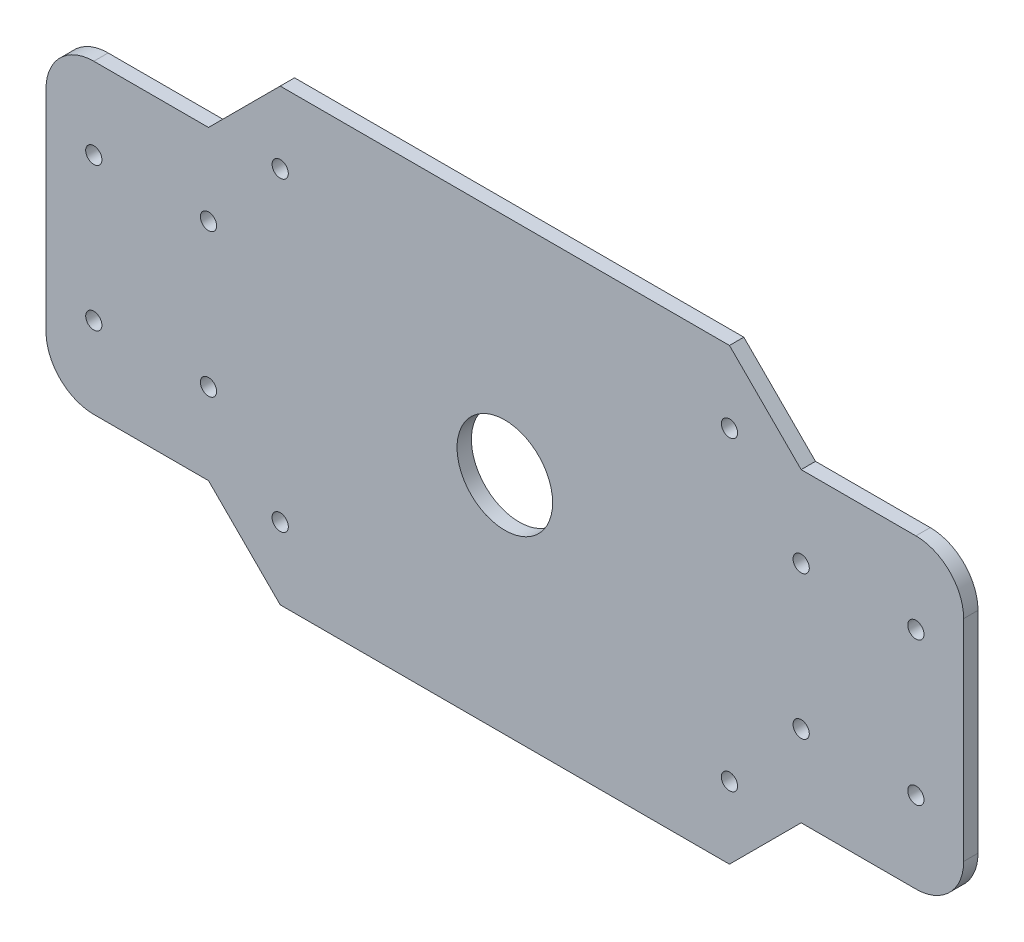
ISO-10303-21;
HEADER;
FILE_DESCRIPTION(('STEP AP214'),'2;1');
FILE_NAME('part.step','',(''),(''),'','','');
FILE_SCHEMA(('AUTOMOTIVE_DESIGN { 1 0 10303 214 1 1 1 1 }'));
ENDSEC;
DATA;
#1=APPLICATION_CONTEXT('core data for automotive mechanical design processes');
#2=APPLICATION_PROTOCOL_DEFINITION('international standard','automotive_design',2000,#1);
#3=PRODUCT_CONTEXT('',#1,'mechanical');
#4=PRODUCT('Part','Part','',(#3));
#5=PRODUCT_RELATED_PRODUCT_CATEGORY('part','',(#4));
#6=PRODUCT_DEFINITION_FORMATION('','',#4);
#7=PRODUCT_DEFINITION_CONTEXT('part definition',#1,'design');
#8=PRODUCT_DEFINITION('design','',#6,#7);
#9=PRODUCT_DEFINITION_SHAPE('','',#8);
#10=(LENGTH_UNIT() NAMED_UNIT(*) SI_UNIT(.MILLI.,.METRE.));
#11=(NAMED_UNIT(*) PLANE_ANGLE_UNIT() SI_UNIT($,.RADIAN.));
#12=(NAMED_UNIT(*) SI_UNIT($,.STERADIAN.) SOLID_ANGLE_UNIT());
#13=UNCERTAINTY_MEASURE_WITH_UNIT(LENGTH_MEASURE(1.E-05),#10,'distance_accuracy_value','');
#14=(GEOMETRIC_REPRESENTATION_CONTEXT(3) GLOBAL_UNCERTAINTY_ASSIGNED_CONTEXT((#13)) GLOBAL_UNIT_ASSIGNED_CONTEXT((#10,
#11,#12)) REPRESENTATION_CONTEXT('',''));
#15=CARTESIAN_POINT('',(0.,0.,0.));
#16=DIRECTION('',(0.,0.,1.));
#17=DIRECTION('',(1.,0.,0.));
#18=AXIS2_PLACEMENT_3D('',#15,#16,#17);
#19=CARTESIAN_POINT('',(-86.0000000000001,-24.5497889815793,3.));
#20=DIRECTION('',(0.,0.,1.));
#21=DIRECTION('',(1.,0.,0.));
#22=AXIS2_PLACEMENT_3D('',#19,#20,#21);
#23=PLANE('',#22);
#24=CARTESIAN_POINT('',(47.,-78.5497889815793,3.));
#25=DIRECTION('',(0.,0.,1.));
#26=DIRECTION('',(1.,0.,0.));
#27=AXIS2_PLACEMENT_3D('',#24,#25,#26);
#28=CIRCLE('',#27,1.70000000003747);
#29=CARTESIAN_POINT('',(48.7000000000375,-78.5497889815793,3.));
#30=VERTEX_POINT('',#29);
#31=EDGE_CURVE('E385',#30,#30,#28,.T.);
#32=ORIENTED_EDGE('',*,*,#31,.F.);
#33=EDGE_LOOP('',(#32));
#34=FACE_BOUND('',#33,.T.);
#35=CARTESIAN_POINT('',(-47.,-14.5497889815793,3.));
#36=DIRECTION('',(0.,0.,1.));
#37=DIRECTION('',(1.,0.,0.));
#38=AXIS2_PLACEMENT_3D('',#35,#36,#37);
#39=CIRCLE('',#38,1.70000000004367);
#40=CARTESIAN_POINT('',(-45.2999999999563,-14.5497889815793,3.));
#41=VERTEX_POINT('',#40);
#42=EDGE_CURVE('E397',#41,#41,#39,.T.);
#43=ORIENTED_EDGE('',*,*,#42,.F.);
#44=EDGE_LOOP('',(#43));
#45=FACE_BOUND('',#44,.T.);
#46=CARTESIAN_POINT('',(62.0000000000001,-31.5497889815793,3.));
#47=DIRECTION('',(0.,0.,1.));
#48=DIRECTION('',(1.,0.,0.));
#49=AXIS2_PLACEMENT_3D('',#46,#47,#48);
#50=CIRCLE('',#49,1.69999999931605);
#51=CARTESIAN_POINT('',(63.6999999993161,-31.5497889815793,3.));
#52=VERTEX_POINT('',#51);
#53=EDGE_CURVE('E409',#52,#52,#50,.T.);
#54=ORIENTED_EDGE('',*,*,#53,.F.);
#55=EDGE_LOOP('',(#54));
#56=FACE_BOUND('',#55,.T.);
#57=CARTESIAN_POINT('',(62.0000000000001,-61.5497889815793,3.));
#58=DIRECTION('',(0.,0.,1.));
#59=DIRECTION('',(1.,0.,0.));
#60=AXIS2_PLACEMENT_3D('',#57,#58,#59);
#61=CIRCLE('',#60,1.69999999931605);
#62=CARTESIAN_POINT('',(63.6999999993161,-61.5497889815793,3.));
#63=VERTEX_POINT('',#62);
#64=EDGE_CURVE('E421',#63,#63,#61,.T.);
#65=ORIENTED_EDGE('',*,*,#64,.F.);
#66=EDGE_LOOP('',(#65));
#67=FACE_BOUND('',#66,.T.);
#68=CARTESIAN_POINT('',(-62.0000000000001,-61.5497889815793,3.));
#69=DIRECTION('',(0.,0.,1.));
#70=DIRECTION('',(1.,0.,0.));
#71=AXIS2_PLACEMENT_3D('',#68,#69,#70);
#72=CIRCLE('',#71,1.69999999767219);
#73=CARTESIAN_POINT('',(-60.3000000023279,-61.5497889815793,3.));
#74=VERTEX_POINT('',#73);
#75=EDGE_CURVE('E433',#74,#74,#72,.T.);
#76=ORIENTED_EDGE('',*,*,#75,.F.);
#77=EDGE_LOOP('',(#76));
#78=FACE_BOUND('',#77,.T.);
#79=CARTESIAN_POINT('',(-86.0000000000001,-31.5497889815793,3.));
#80=DIRECTION('',(0.,0.,1.));
#81=DIRECTION('',(1.,0.,0.));
#82=AXIS2_PLACEMENT_3D('',#79,#80,#81);
#83=CIRCLE('',#82,1.69999999767218);
#84=CARTESIAN_POINT('',(-84.3000000023279,-31.5497889815793,3.));
#85=VERTEX_POINT('',#84);
#86=EDGE_CURVE('E445',#85,#85,#83,.T.);
#87=ORIENTED_EDGE('',*,*,#86,.F.);
#88=EDGE_LOOP('',(#87));
#89=FACE_BOUND('',#88,.T.);
#90=CARTESIAN_POINT('',(-86.0000000000001,-24.5497889815793,3.));
#91=DIRECTION('',(0.,0.,1.));
#92=DIRECTION('',(1.,0.,0.));
#93=AXIS2_PLACEMENT_3D('',#90,#91,#92);
#94=CIRCLE('',#93,9.99999999999998);
#95=CARTESIAN_POINT('',(-86.0000000000001,-14.5497889815793,3.));
#96=VERTEX_POINT('',#95);
#97=CARTESIAN_POINT('',(-96.0000000000001,-24.5497889815793,3.));
#98=VERTEX_POINT('',#97);
#99=EDGE_CURVE('E215',#96,#98,#94,.T.);
#100=ORIENTED_EDGE('',*,*,#99,.T.);
#101=DIRECTION('',(0.,-1.,0.));
#102=VECTOR('',#101,1.);
#103=CARTESIAN_POINT('',(-96.0000000000001,-24.5497889815793,3.));
#104=LINE('',#103,#102);
#105=CARTESIAN_POINT('',(-96.0000000000001,-68.5497889815793,3.));
#106=VERTEX_POINT('',#105);
#107=EDGE_CURVE('E123',#98,#106,#104,.T.);
#108=ORIENTED_EDGE('',*,*,#107,.T.);
#109=CARTESIAN_POINT('',(-86.0000000000001,-68.5497889815793,3.));
#110=DIRECTION('',(0.,0.,1.));
#111=DIRECTION('',(1.,0.,0.));
#112=AXIS2_PLACEMENT_3D('',#109,#110,#111);
#113=CIRCLE('',#112,9.99999999999998);
#114=CARTESIAN_POINT('',(-86.0000000000001,-78.5497889815793,3.));
#115=VERTEX_POINT('',#114);
#116=EDGE_CURVE('E254',#106,#115,#113,.T.);
#117=ORIENTED_EDGE('',*,*,#116,.T.);
#118=DIRECTION('',(1.,0.,0.));
#119=VECTOR('',#118,1.);
#120=CARTESIAN_POINT('',(-86.0000000000001,-78.5497889815793,3.));
#121=LINE('',#120,#119);
#122=CARTESIAN_POINT('',(-62.,-78.5497889815793,3.));
#123=VERTEX_POINT('',#122);
#124=EDGE_CURVE('E273',#115,#123,#121,.T.);
#125=ORIENTED_EDGE('',*,*,#124,.T.);
#126=DIRECTION('',(0.707106781186547,-0.707106781186548,0.));
#127=VECTOR('',#126,1.);
#128=CARTESIAN_POINT('',(-62.,-78.5497889815793,3.));
#129=LINE('',#128,#127);
#130=CARTESIAN_POINT('',(-47.,-93.5497889815793,3.));
#131=VERTEX_POINT('',#130);
#132=EDGE_CURVE('E270',#123,#131,#129,.T.);
#133=ORIENTED_EDGE('',*,*,#132,.T.);
#134=DIRECTION('',(1.,0.,0.));
#135=VECTOR('',#134,1.);
#136=CARTESIAN_POINT('',(-47.,-93.5497889815793,3.));
#137=LINE('',#136,#135);
#138=CARTESIAN_POINT('',(47.,-93.5497889815793,3.));
#139=VERTEX_POINT('',#138);
#140=EDGE_CURVE('E272',#131,#139,#137,.T.);
#141=ORIENTED_EDGE('',*,*,#140,.T.);
#142=DIRECTION('',(0.707106781186546,0.707106781186549,0.));
#143=VECTOR('',#142,1.);
#144=CARTESIAN_POINT('',(47.,-93.5497889815793,3.));
#145=LINE('',#144,#143);
#146=CARTESIAN_POINT('',(62.,-78.5497889815793,3.));
#147=VERTEX_POINT('',#146);
#148=EDGE_CURVE('E275',#139,#147,#145,.T.);
#149=ORIENTED_EDGE('',*,*,#148,.T.);
#150=DIRECTION('',(1.,0.,0.));
#151=VECTOR('',#150,1.);
#152=CARTESIAN_POINT('',(62.,-78.5497889815793,3.));
#153=LINE('',#152,#151);
#154=CARTESIAN_POINT('',(86.,-78.5497889815793,3.));
#155=VERTEX_POINT('',#154);
#156=EDGE_CURVE('E281',#147,#155,#153,.T.);
#157=ORIENTED_EDGE('',*,*,#156,.T.);
#158=CARTESIAN_POINT('',(86.,-68.5497889815793,3.));
#159=DIRECTION('',(0.,0.,1.));
#160=DIRECTION('',(1.,0.,0.));
#161=AXIS2_PLACEMENT_3D('',#158,#159,#160);
#162=CIRCLE('',#161,9.99999999999999);
#163=CARTESIAN_POINT('',(96.,-68.5497889815793,3.));
#164=VERTEX_POINT('',#163);
#165=EDGE_CURVE('E283',#155,#164,#162,.T.);
#166=ORIENTED_EDGE('',*,*,#165,.T.);
#167=DIRECTION('',(0.,1.,0.));
#168=VECTOR('',#167,1.);
#169=CARTESIAN_POINT('',(96.,-24.5497889815793,3.));
#170=LINE('',#169,#168);
#171=CARTESIAN_POINT('',(96.,-24.5497889815793,3.));
#172=VERTEX_POINT('',#171);
#173=EDGE_CURVE('E285',#164,#172,#170,.T.);
#174=ORIENTED_EDGE('',*,*,#173,.T.);
#175=CARTESIAN_POINT('',(86.,-24.5497889815793,3.));
#176=DIRECTION('',(0.,0.,1.));
#177=DIRECTION('',(1.,0.,0.));
#178=AXIS2_PLACEMENT_3D('',#175,#176,#177);
#179=CIRCLE('',#178,9.99999999999999);
#180=CARTESIAN_POINT('',(86.,-14.5497889815793,3.));
#181=VERTEX_POINT('',#180);
#182=EDGE_CURVE('E287',#172,#181,#179,.T.);
#183=ORIENTED_EDGE('',*,*,#182,.T.);
#184=DIRECTION('',(-1.,0.,0.));
#185=VECTOR('',#184,1.);
#186=CARTESIAN_POINT('',(62.,-14.5497889815793,3.));
#187=LINE('',#186,#185);
#188=CARTESIAN_POINT('',(62.,-14.5497889815793,3.));
#189=VERTEX_POINT('',#188);
#190=EDGE_CURVE('E289',#181,#189,#187,.T.);
#191=ORIENTED_EDGE('',*,*,#190,.T.);
#192=DIRECTION('',(-0.707106781186547,0.707106781186548,0.));
#193=VECTOR('',#192,1.);
#194=CARTESIAN_POINT('',(47.,0.450211018420688,3.));
#195=LINE('',#194,#193);
#196=CARTESIAN_POINT('',(47.,0.450211018420688,3.));
#197=VERTEX_POINT('',#196);
#198=EDGE_CURVE('E166',#189,#197,#195,.T.);
#199=ORIENTED_EDGE('',*,*,#198,.T.);
#200=DIRECTION('',(-1.,0.,0.));
#201=VECTOR('',#200,1.);
#202=CARTESIAN_POINT('',(-47.,0.450211018420688,3.));
#203=LINE('',#202,#201);
#204=CARTESIAN_POINT('',(-47.,0.450211018420688,3.));
#205=VERTEX_POINT('',#204);
#206=EDGE_CURVE('E160',#197,#205,#203,.T.);
#207=ORIENTED_EDGE('',*,*,#206,.T.);
#208=DIRECTION('',(-0.707106781186547,-0.707106781186548,0.));
#209=VECTOR('',#208,1.);
#210=CARTESIAN_POINT('',(-62.,-14.5497889815793,3.));
#211=LINE('',#210,#209);
#212=CARTESIAN_POINT('',(-62.,-14.5497889815793,3.));
#213=VERTEX_POINT('',#212);
#214=EDGE_CURVE('E164',#205,#213,#211,.T.);
#215=ORIENTED_EDGE('',*,*,#214,.T.);
#216=DIRECTION('',(-1.,0.,0.));
#217=VECTOR('',#216,1.);
#218=CARTESIAN_POINT('',(-86.0000000000001,-14.5497889815793,3.));
#219=LINE('',#218,#217);
#220=EDGE_CURVE('E56',#213,#96,#219,.T.);
#221=ORIENTED_EDGE('',*,*,#220,.T.);
#222=EDGE_LOOP('',(#100,#108,#117,#125,#133,#141,#149,#157,#166,#174,#183,#191,#199,#207,#215,#221));
#223=FACE_BOUND('',#222,.T.);
#224=CARTESIAN_POINT('',(-62.0000000000001,-31.5497889815793,3.));
#225=DIRECTION('',(0.,0.,1.));
#226=DIRECTION('',(1.,0.,0.));
#227=AXIS2_PLACEMENT_3D('',#224,#225,#226);
#228=CIRCLE('',#227,1.69999999767221);
#229=CARTESIAN_POINT('',(-60.3000000023278,-31.5497889815793,3.));
#230=VERTEX_POINT('',#229);
#231=EDGE_CURVE('E188',#230,#230,#228,.T.);
#232=ORIENTED_EDGE('',*,*,#231,.F.);
#233=EDGE_LOOP('',(#232));
#234=FACE_BOUND('',#233,.T.);
#235=CARTESIAN_POINT('',(-86.0000000000001,-61.5497889815793,3.));
#236=DIRECTION('',(0.,0.,1.));
#237=DIRECTION('',(1.,0.,0.));
#238=AXIS2_PLACEMENT_3D('',#235,#236,#237);
#239=CIRCLE('',#238,1.69999999767218);
#240=CARTESIAN_POINT('',(-84.3000000023279,-61.5497889815793,3.));
#241=VERTEX_POINT('',#240);
#242=EDGE_CURVE('E439',#241,#241,#239,.T.);
#243=ORIENTED_EDGE('',*,*,#242,.F.);
#244=EDGE_LOOP('',(#243));
#245=FACE_BOUND('',#244,.T.);
#246=CARTESIAN_POINT('',(86.0000000000001,-61.5497889815793,3.));
#247=DIRECTION('',(0.,0.,1.));
#248=DIRECTION('',(1.,0.,0.));
#249=AXIS2_PLACEMENT_3D('',#246,#247,#248);
#250=CIRCLE('',#249,1.69999999931604);
#251=CARTESIAN_POINT('',(87.6999999993161,-61.5497889815793,3.));
#252=VERTEX_POINT('',#251);
#253=EDGE_CURVE('E427',#252,#252,#250,.T.);
#254=ORIENTED_EDGE('',*,*,#253,.F.);
#255=EDGE_LOOP('',(#254));
#256=FACE_BOUND('',#255,.T.);
#257=CARTESIAN_POINT('',(86.0000000000001,-31.5497889815793,3.));
#258=DIRECTION('',(0.,0.,1.));
#259=DIRECTION('',(1.,0.,0.));
#260=AXIS2_PLACEMENT_3D('',#257,#258,#259);
#261=CIRCLE('',#260,1.69999999931607);
#262=CARTESIAN_POINT('',(87.6999999993162,-31.5497889815793,3.));
#263=VERTEX_POINT('',#262);
#264=EDGE_CURVE('E415',#263,#263,#261,.T.);
#265=ORIENTED_EDGE('',*,*,#264,.F.);
#266=EDGE_LOOP('',(#265));
#267=FACE_BOUND('',#266,.T.);
#268=CARTESIAN_POINT('',(0.,-46.5497889815793,3.));
#269=DIRECTION('',(0.,0.,1.));
#270=DIRECTION('',(1.,0.,0.));
#271=AXIS2_PLACEMENT_3D('',#268,#269,#270);
#272=CIRCLE('',#271,10.);
#273=CARTESIAN_POINT('',(10.,-46.5497889815793,3.));
#274=VERTEX_POINT('',#273);
#275=EDGE_CURVE('E403',#274,#274,#272,.T.);
#276=ORIENTED_EDGE('',*,*,#275,.F.);
#277=EDGE_LOOP('',(#276));
#278=FACE_BOUND('',#277,.T.);
#279=CARTESIAN_POINT('',(-47.,-78.5497889815793,3.));
#280=DIRECTION('',(0.,0.,1.));
#281=DIRECTION('',(1.,0.,0.));
#282=AXIS2_PLACEMENT_3D('',#279,#280,#281);
#283=CIRCLE('',#282,1.70000000003746);
#284=CARTESIAN_POINT('',(-45.2999999999626,-78.5497889815793,3.));
#285=VERTEX_POINT('',#284);
#286=EDGE_CURVE('E391',#285,#285,#283,.T.);
#287=ORIENTED_EDGE('',*,*,#286,.F.);
#288=EDGE_LOOP('',(#287));
#289=FACE_BOUND('',#288,.T.);
#290=CARTESIAN_POINT('',(47.,-14.5497889815793,3.));
#291=DIRECTION('',(0.,0.,1.));
#292=DIRECTION('',(1.,0.,0.));
#293=AXIS2_PLACEMENT_3D('',#290,#291,#292);
#294=CIRCLE('',#293,1.70000000004365);
#295=CARTESIAN_POINT('',(48.7000000000437,-14.5497889815793,3.));
#296=VERTEX_POINT('',#295);
#297=EDGE_CURVE('E376',#296,#296,#294,.T.);
#298=ORIENTED_EDGE('',*,*,#297,.F.);
#299=EDGE_LOOP('',(#298));
#300=FACE_BOUND('',#299,.T.);
#301=ADVANCED_FACE('F39',(#34,#45,#56,#67,#78,#89,#223,#234,#245,#256,#267,#278,#289,#300),#23,.T.);
#302=CARTESIAN_POINT('',(-86.0000000000001,-24.5497889815793,0.));
#303=DIRECTION('',(0.,0.,1.));
#304=DIRECTION('',(1.,0.,0.));
#305=AXIS2_PLACEMENT_3D('',#302,#303,#304);
#306=PLANE('',#305);
#307=CARTESIAN_POINT('',(-86.0000000000001,-24.5497889815793,0.));
#308=DIRECTION('',(0.,0.,1.));
#309=DIRECTION('',(1.,0.,0.));
#310=AXIS2_PLACEMENT_3D('',#307,#308,#309);
#311=CIRCLE('',#310,9.99999999999998);
#312=CARTESIAN_POINT('',(-86.0000000000001,-14.5497889815793,0.));
#313=VERTEX_POINT('',#312);
#314=CARTESIAN_POINT('',(-96.0000000000001,-24.5497889815793,0.));
#315=VERTEX_POINT('',#314);
#316=EDGE_CURVE('E184',#313,#315,#311,.T.);
#317=ORIENTED_EDGE('',*,*,#316,.F.);
#318=DIRECTION('',(-1.,0.,0.));
#319=VECTOR('',#318,1.);
#320=CARTESIAN_POINT('',(-86.0000000000001,-14.5497889815793,0.));
#321=LINE('',#320,#319);
#322=CARTESIAN_POINT('',(-62.,-14.5497889815793,0.));
#323=VERTEX_POINT('',#322);
#324=EDGE_CURVE('E115',#323,#313,#321,.T.);
#325=ORIENTED_EDGE('',*,*,#324,.F.);
#326=DIRECTION('',(-0.707106781186547,-0.707106781186548,0.));
#327=VECTOR('',#326,1.);
#328=CARTESIAN_POINT('',(-62.,-14.5497889815793,0.));
#329=LINE('',#328,#327);
#330=CARTESIAN_POINT('',(-47.,0.450211018420688,0.));
#331=VERTEX_POINT('',#330);
#332=EDGE_CURVE('E109',#331,#323,#329,.T.);
#333=ORIENTED_EDGE('',*,*,#332,.F.);
#334=DIRECTION('',(-1.,0.,0.));
#335=VECTOR('',#334,1.);
#336=CARTESIAN_POINT('',(-47.,0.450211018420688,0.));
#337=LINE('',#336,#335);
#338=CARTESIAN_POINT('',(47.,0.450211018420688,0.));
#339=VERTEX_POINT('',#338);
#340=EDGE_CURVE('E174',#339,#331,#337,.T.);
#341=ORIENTED_EDGE('',*,*,#340,.F.);
#342=DIRECTION('',(-0.707106781186547,0.707106781186548,0.));
#343=VECTOR('',#342,1.);
#344=CARTESIAN_POINT('',(47.,0.450211018420688,0.));
#345=LINE('',#344,#343);
#346=CARTESIAN_POINT('',(62.,-14.5497889815793,0.));
#347=VERTEX_POINT('',#346);
#348=EDGE_CURVE('E210',#347,#339,#345,.T.);
#349=ORIENTED_EDGE('',*,*,#348,.F.);
#350=DIRECTION('',(-1.,0.,0.));
#351=VECTOR('',#350,1.);
#352=CARTESIAN_POINT('',(62.,-14.5497889815793,0.));
#353=LINE('',#352,#351);
#354=CARTESIAN_POINT('',(86.,-14.5497889815793,0.));
#355=VERTEX_POINT('',#354);
#356=EDGE_CURVE('E208',#355,#347,#353,.T.);
#357=ORIENTED_EDGE('',*,*,#356,.F.);
#358=CARTESIAN_POINT('',(86.,-24.5497889815793,0.));
#359=DIRECTION('',(0.,0.,1.));
#360=DIRECTION('',(1.,0.,0.));
#361=AXIS2_PLACEMENT_3D('',#358,#359,#360);
#362=CIRCLE('',#361,9.99999999999999);
#363=CARTESIAN_POINT('',(96.,-24.5497889815793,0.));
#364=VERTEX_POINT('',#363);
#365=EDGE_CURVE('E206',#364,#355,#362,.T.);
#366=ORIENTED_EDGE('',*,*,#365,.F.);
#367=DIRECTION('',(0.,1.,0.));
#368=VECTOR('',#367,1.);
#369=CARTESIAN_POINT('',(96.,-24.5497889815793,0.));
#370=LINE('',#369,#368);
#371=CARTESIAN_POINT('',(96.,-68.5497889815793,0.));
#372=VERTEX_POINT('',#371);
#373=EDGE_CURVE('E204',#372,#364,#370,.T.);
#374=ORIENTED_EDGE('',*,*,#373,.F.);
#375=CARTESIAN_POINT('',(86.,-68.5497889815793,0.));
#376=DIRECTION('',(0.,0.,1.));
#377=DIRECTION('',(1.,0.,0.));
#378=AXIS2_PLACEMENT_3D('',#375,#376,#377);
#379=CIRCLE('',#378,9.99999999999999);
#380=CARTESIAN_POINT('',(86.,-78.5497889815793,0.));
#381=VERTEX_POINT('',#380);
#382=EDGE_CURVE('E202',#381,#372,#379,.T.);
#383=ORIENTED_EDGE('',*,*,#382,.F.);
#384=DIRECTION('',(1.,0.,0.));
#385=VECTOR('',#384,1.);
#386=CARTESIAN_POINT('',(62.,-78.5497889815793,0.));
#387=LINE('',#386,#385);
#388=CARTESIAN_POINT('',(62.,-78.5497889815793,0.));
#389=VERTEX_POINT('',#388);
#390=EDGE_CURVE('E200',#389,#381,#387,.T.);
#391=ORIENTED_EDGE('',*,*,#390,.F.);
#392=DIRECTION('',(0.707106781186546,0.707106781186549,0.));
#393=VECTOR('',#392,1.);
#394=CARTESIAN_POINT('',(47.,-93.5497889815793,0.));
#395=LINE('',#394,#393);
#396=CARTESIAN_POINT('',(47.,-93.5497889815793,0.));
#397=VERTEX_POINT('',#396);
#398=EDGE_CURVE('E198',#397,#389,#395,.T.);
#399=ORIENTED_EDGE('',*,*,#398,.F.);
#400=DIRECTION('',(1.,0.,0.));
#401=VECTOR('',#400,1.);
#402=CARTESIAN_POINT('',(-47.,-93.5497889815793,0.));
#403=LINE('',#402,#401);
#404=CARTESIAN_POINT('',(-47.,-93.5497889815793,0.));
#405=VERTEX_POINT('',#404);
#406=EDGE_CURVE('E196',#405,#397,#403,.T.);
#407=ORIENTED_EDGE('',*,*,#406,.F.);
#408=DIRECTION('',(0.707106781186547,-0.707106781186548,0.));
#409=VECTOR('',#408,1.);
#410=CARTESIAN_POINT('',(-62.,-78.5497889815793,0.));
#411=LINE('',#410,#409);
#412=CARTESIAN_POINT('',(-62.,-78.5497889815793,0.));
#413=VERTEX_POINT('',#412);
#414=EDGE_CURVE('E194',#413,#405,#411,.T.);
#415=ORIENTED_EDGE('',*,*,#414,.F.);
#416=DIRECTION('',(1.,0.,0.));
#417=VECTOR('',#416,1.);
#418=CARTESIAN_POINT('',(-86.0000000000001,-78.5497889815793,0.));
#419=LINE('',#418,#417);
#420=CARTESIAN_POINT('',(-86.0000000000001,-78.5497889815793,0.));
#421=VERTEX_POINT('',#420);
#422=EDGE_CURVE('E192',#421,#413,#419,.T.);
#423=ORIENTED_EDGE('',*,*,#422,.F.);
#424=CARTESIAN_POINT('',(-86.0000000000001,-68.5497889815793,0.));
#425=DIRECTION('',(0.,0.,1.));
#426=DIRECTION('',(1.,0.,0.));
#427=AXIS2_PLACEMENT_3D('',#424,#425,#426);
#428=CIRCLE('',#427,9.99999999999998);
#429=CARTESIAN_POINT('',(-96.0000000000001,-68.5497889815793,0.));
#430=VERTEX_POINT('',#429);
#431=EDGE_CURVE('E190',#430,#421,#428,.T.);
#432=ORIENTED_EDGE('',*,*,#431,.F.);
#433=DIRECTION('',(0.,-1.,0.));
#434=VECTOR('',#433,1.);
#435=CARTESIAN_POINT('',(-96.0000000000001,-24.5497889815793,0.));
#436=LINE('',#435,#434);
#437=EDGE_CURVE('E187',#315,#430,#436,.T.);
#438=ORIENTED_EDGE('',*,*,#437,.F.);
#439=EDGE_LOOP('',(#317,#325,#333,#341,#349,#357,#366,#374,#383,#391,#399,#407,#415,#423,#432,#438));
#440=FACE_BOUND('',#439,.T.);
#441=CARTESIAN_POINT('',(-62.0000000000001,-31.5497889815793,0.));
#442=DIRECTION('',(0.,0.,1.));
#443=DIRECTION('',(1.,0.,0.));
#444=AXIS2_PLACEMENT_3D('',#441,#442,#443);
#445=CIRCLE('',#444,1.69999999767221);
#446=CARTESIAN_POINT('',(-60.3000000023278,-31.5497889815793,0.));
#447=VERTEX_POINT('',#446);
#448=EDGE_CURVE('E448',#447,#447,#445,.T.);
#449=ORIENTED_EDGE('',*,*,#448,.T.);
#450=EDGE_LOOP('',(#449));
#451=FACE_BOUND('',#450,.T.);
#452=CARTESIAN_POINT('',(-86.0000000000001,-31.5497889815793,0.));
#453=DIRECTION('',(0.,0.,1.));
#454=DIRECTION('',(1.,0.,0.));
#455=AXIS2_PLACEMENT_3D('',#452,#453,#454);
#456=CIRCLE('',#455,1.69999999767218);
#457=CARTESIAN_POINT('',(-84.3000000023279,-31.5497889815793,0.));
#458=VERTEX_POINT('',#457);
#459=EDGE_CURVE('E442',#458,#458,#456,.T.);
#460=ORIENTED_EDGE('',*,*,#459,.T.);
#461=EDGE_LOOP('',(#460));
#462=FACE_BOUND('',#461,.T.);
#463=CARTESIAN_POINT('',(-86.0000000000001,-61.5497889815793,0.));
#464=DIRECTION('',(0.,0.,1.));
#465=DIRECTION('',(1.,0.,0.));
#466=AXIS2_PLACEMENT_3D('',#463,#464,#465);
#467=CIRCLE('',#466,1.69999999767218);
#468=CARTESIAN_POINT('',(-84.3000000023279,-61.5497889815793,0.));
#469=VERTEX_POINT('',#468);
#470=EDGE_CURVE('E436',#469,#469,#467,.T.);
#471=ORIENTED_EDGE('',*,*,#470,.T.);
#472=EDGE_LOOP('',(#471));
#473=FACE_BOUND('',#472,.T.);
#474=CARTESIAN_POINT('',(-62.0000000000001,-61.5497889815793,0.));
#475=DIRECTION('',(0.,0.,1.));
#476=DIRECTION('',(1.,0.,0.));
#477=AXIS2_PLACEMENT_3D('',#474,#475,#476);
#478=CIRCLE('',#477,1.69999999767219);
#479=CARTESIAN_POINT('',(-60.3000000023279,-61.5497889815793,0.));
#480=VERTEX_POINT('',#479);
#481=EDGE_CURVE('E430',#480,#480,#478,.T.);
#482=ORIENTED_EDGE('',*,*,#481,.T.);
#483=EDGE_LOOP('',(#482));
#484=FACE_BOUND('',#483,.T.);
#485=CARTESIAN_POINT('',(86.0000000000001,-61.5497889815793,0.));
#486=DIRECTION('',(0.,0.,1.));
#487=DIRECTION('',(1.,0.,0.));
#488=AXIS2_PLACEMENT_3D('',#485,#486,#487);
#489=CIRCLE('',#488,1.69999999931604);
#490=CARTESIAN_POINT('',(87.6999999993161,-61.5497889815793,0.));
#491=VERTEX_POINT('',#490);
#492=EDGE_CURVE('E424',#491,#491,#489,.T.);
#493=ORIENTED_EDGE('',*,*,#492,.T.);
#494=EDGE_LOOP('',(#493));
#495=FACE_BOUND('',#494,.T.);
#496=CARTESIAN_POINT('',(62.0000000000001,-61.5497889815793,0.));
#497=DIRECTION('',(0.,0.,1.));
#498=DIRECTION('',(1.,0.,0.));
#499=AXIS2_PLACEMENT_3D('',#496,#497,#498);
#500=CIRCLE('',#499,1.69999999931605);
#501=CARTESIAN_POINT('',(63.6999999993161,-61.5497889815793,0.));
#502=VERTEX_POINT('',#501);
#503=EDGE_CURVE('E418',#502,#502,#500,.T.);
#504=ORIENTED_EDGE('',*,*,#503,.T.);
#505=EDGE_LOOP('',(#504));
#506=FACE_BOUND('',#505,.T.);
#507=CARTESIAN_POINT('',(86.0000000000001,-31.5497889815793,0.));
#508=DIRECTION('',(0.,0.,1.));
#509=DIRECTION('',(1.,0.,0.));
#510=AXIS2_PLACEMENT_3D('',#507,#508,#509);
#511=CIRCLE('',#510,1.69999999931607);
#512=CARTESIAN_POINT('',(87.6999999993162,-31.5497889815793,0.));
#513=VERTEX_POINT('',#512);
#514=EDGE_CURVE('E412',#513,#513,#511,.T.);
#515=ORIENTED_EDGE('',*,*,#514,.T.);
#516=EDGE_LOOP('',(#515));
#517=FACE_BOUND('',#516,.T.);
#518=CARTESIAN_POINT('',(62.0000000000001,-31.5497889815793,0.));
#519=DIRECTION('',(0.,0.,1.));
#520=DIRECTION('',(1.,0.,0.));
#521=AXIS2_PLACEMENT_3D('',#518,#519,#520);
#522=CIRCLE('',#521,1.69999999931605);
#523=CARTESIAN_POINT('',(63.6999999993161,-31.5497889815793,0.));
#524=VERTEX_POINT('',#523);
#525=EDGE_CURVE('E406',#524,#524,#522,.T.);
#526=ORIENTED_EDGE('',*,*,#525,.T.);
#527=EDGE_LOOP('',(#526));
#528=FACE_BOUND('',#527,.T.);
#529=CARTESIAN_POINT('',(0.,-46.5497889815793,0.));
#530=DIRECTION('',(0.,0.,1.));
#531=DIRECTION('',(1.,0.,0.));
#532=AXIS2_PLACEMENT_3D('',#529,#530,#531);
#533=CIRCLE('',#532,10.);
#534=CARTESIAN_POINT('',(10.,-46.5497889815793,0.));
#535=VERTEX_POINT('',#534);
#536=EDGE_CURVE('E400',#535,#535,#533,.T.);
#537=ORIENTED_EDGE('',*,*,#536,.T.);
#538=EDGE_LOOP('',(#537));
#539=FACE_BOUND('',#538,.T.);
#540=CARTESIAN_POINT('',(-47.,-14.5497889815793,0.));
#541=DIRECTION('',(0.,0.,1.));
#542=DIRECTION('',(1.,0.,0.));
#543=AXIS2_PLACEMENT_3D('',#540,#541,#542);
#544=CIRCLE('',#543,1.70000000004367);
#545=CARTESIAN_POINT('',(-45.2999999999563,-14.5497889815793,0.));
#546=VERTEX_POINT('',#545);
#547=EDGE_CURVE('E394',#546,#546,#544,.T.);
#548=ORIENTED_EDGE('',*,*,#547,.T.);
#549=EDGE_LOOP('',(#548));
#550=FACE_BOUND('',#549,.T.);
#551=CARTESIAN_POINT('',(-47.,-78.5497889815793,0.));
#552=DIRECTION('',(0.,0.,1.));
#553=DIRECTION('',(1.,0.,0.));
#554=AXIS2_PLACEMENT_3D('',#551,#552,#553);
#555=CIRCLE('',#554,1.70000000003746);
#556=CARTESIAN_POINT('',(-45.2999999999626,-78.5497889815793,0.));
#557=VERTEX_POINT('',#556);
#558=EDGE_CURVE('E388',#557,#557,#555,.T.);
#559=ORIENTED_EDGE('',*,*,#558,.T.);
#560=EDGE_LOOP('',(#559));
#561=FACE_BOUND('',#560,.T.);
#562=CARTESIAN_POINT('',(47.,-78.5497889815793,0.));
#563=DIRECTION('',(0.,0.,1.));
#564=DIRECTION('',(1.,0.,0.));
#565=AXIS2_PLACEMENT_3D('',#562,#563,#564);
#566=CIRCLE('',#565,1.70000000003747);
#567=CARTESIAN_POINT('',(48.7000000000375,-78.5497889815793,0.));
#568=VERTEX_POINT('',#567);
#569=EDGE_CURVE('E382',#568,#568,#566,.T.);
#570=ORIENTED_EDGE('',*,*,#569,.T.);
#571=EDGE_LOOP('',(#570));
#572=FACE_BOUND('',#571,.T.);
#573=CARTESIAN_POINT('',(47.,-14.5497889815793,0.));
#574=DIRECTION('',(0.,0.,1.));
#575=DIRECTION('',(1.,0.,0.));
#576=AXIS2_PLACEMENT_3D('',#573,#574,#575);
#577=CIRCLE('',#576,1.70000000004365);
#578=CARTESIAN_POINT('',(48.7000000000437,-14.5497889815793,0.));
#579=VERTEX_POINT('',#578);
#580=EDGE_CURVE('E379',#579,#579,#577,.T.);
#581=ORIENTED_EDGE('',*,*,#580,.T.);
#582=EDGE_LOOP('',(#581));
#583=FACE_BOUND('',#582,.T.);
#584=ADVANCED_FACE('F258',(#440,#451,#462,#473,#484,#495,#506,#517,#528,#539,#550,#561,#572,
#583),#306,.F.);
#585=CARTESIAN_POINT('',(-86.0000000000001,-24.5497889815793,3.));
#586=DIRECTION('',(0.,0.,-1.));
#587=DIRECTION('',(-1.,0.,0.));
#588=AXIS2_PLACEMENT_3D('',#585,#586,#587);
#589=CYLINDRICAL_SURFACE('',#588,9.99999999999998);
#590=ORIENTED_EDGE('',*,*,#316,.T.);
#591=DIRECTION('',(0.,0.,-1.));
#592=VECTOR('',#591,1.);
#593=CARTESIAN_POINT('',(-96.0000000000001,-24.5497889815793,3.));
#594=LINE('',#593,#592);
#595=EDGE_CURVE('E11',#98,#315,#594,.T.);
#596=ORIENTED_EDGE('',*,*,#595,.F.);
#597=ORIENTED_EDGE('',*,*,#99,.F.);
#598=DIRECTION('',(0.,0.,-1.));
#599=VECTOR('',#598,1.);
#600=CARTESIAN_POINT('',(-86.0000000000001,-14.5497889815793,3.));
#601=LINE('',#600,#599);
#602=EDGE_CURVE('E180',#96,#313,#601,.T.);
#603=ORIENTED_EDGE('',*,*,#602,.T.);
#604=EDGE_LOOP('',(#590,#596,#597,#603));
#605=FACE_BOUND('',#604,.T.);
#606=ADVANCED_FACE('F41',(#605),#589,.T.);
#607=CARTESIAN_POINT('',(-96.0000000000001,-24.5497889815793,3.));
#608=DIRECTION('',(1.,0.,0.));
#609=DIRECTION('',(0.,0.,-1.));
#610=AXIS2_PLACEMENT_3D('',#607,#608,#609);
#611=PLANE('',#610);
#612=ORIENTED_EDGE('',*,*,#437,.T.);
#613=DIRECTION('',(0.,0.,-1.));
#614=VECTOR('',#613,1.);
#615=CARTESIAN_POINT('',(-96.0000000000001,-68.5497889815793,3.));
#616=LINE('',#615,#614);
#617=EDGE_CURVE('E48',#106,#430,#616,.T.);
#618=ORIENTED_EDGE('',*,*,#617,.F.);
#619=ORIENTED_EDGE('',*,*,#107,.F.);
#620=ORIENTED_EDGE('',*,*,#595,.T.);
#621=EDGE_LOOP('',(#612,#618,#619,#620));
#622=FACE_BOUND('',#621,.T.);
#623=ADVANCED_FACE('F679',(#622),#611,.F.);
#624=CARTESIAN_POINT('',(-86.0000000000001,-68.5497889815793,3.));
#625=DIRECTION('',(0.,0.,-1.));
#626=DIRECTION('',(-1.,0.,0.));
#627=AXIS2_PLACEMENT_3D('',#624,#625,#626);
#628=CYLINDRICAL_SURFACE('',#627,9.99999999999998);
#629=ORIENTED_EDGE('',*,*,#431,.T.);
#630=DIRECTION('',(0.,0.,-1.));
#631=VECTOR('',#630,1.);
#632=CARTESIAN_POINT('',(-86.0000000000001,-78.5497889815793,3.));
#633=LINE('',#632,#631);
#634=EDGE_CURVE('E246',#115,#421,#633,.T.);
#635=ORIENTED_EDGE('',*,*,#634,.F.);
#636=ORIENTED_EDGE('',*,*,#116,.F.);
#637=ORIENTED_EDGE('',*,*,#617,.T.);
#638=EDGE_LOOP('',(#629,#635,#636,#637));
#639=FACE_BOUND('',#638,.T.);
#640=ADVANCED_FACE('F252',(#639),#628,.T.);
#641=CARTESIAN_POINT('',(-86.0000000000001,-78.5497889815793,3.));
#642=DIRECTION('',(0.,1.,0.));
#643=DIRECTION('',(0.,0.,1.));
#644=AXIS2_PLACEMENT_3D('',#641,#642,#643);
#645=PLANE('',#644);
#646=ORIENTED_EDGE('',*,*,#422,.T.);
#647=DIRECTION('',(0.,0.,-1.));
#648=VECTOR('',#647,1.);
#649=CARTESIAN_POINT('',(-62.,-78.5497889815793,3.));
#650=LINE('',#649,#648);
#651=EDGE_CURVE('E243',#123,#413,#650,.T.);
#652=ORIENTED_EDGE('',*,*,#651,.F.);
#653=ORIENTED_EDGE('',*,*,#124,.F.);
#654=ORIENTED_EDGE('',*,*,#634,.T.);
#655=EDGE_LOOP('',(#646,#652,#653,#654));
#656=FACE_BOUND('',#655,.T.);
#657=ADVANCED_FACE('F264',(#656),#645,.F.);
#658=CARTESIAN_POINT('',(-62.,-78.5497889815793,3.));
#659=DIRECTION('',(0.707106781186548,0.707106781186547,0.));
#660=DIRECTION('',(-0.707106781186547,0.707106781186548,0.));
#661=AXIS2_PLACEMENT_3D('',#658,#659,#660);
#662=PLANE('',#661);
#663=ORIENTED_EDGE('',*,*,#414,.T.);
#664=DIRECTION('',(0.,0.,-1.));
#665=VECTOR('',#664,1.);
#666=CARTESIAN_POINT('',(-47.,-93.5497889815793,3.));
#667=LINE('',#666,#665);
#668=EDGE_CURVE('E240',#131,#405,#667,.T.);
#669=ORIENTED_EDGE('',*,*,#668,.F.);
#670=ORIENTED_EDGE('',*,*,#132,.F.);
#671=ORIENTED_EDGE('',*,*,#651,.T.);
#672=EDGE_LOOP('',(#663,#669,#670,#671));
#673=FACE_BOUND('',#672,.T.);
#674=ADVANCED_FACE('F268',(#673),#662,.F.);
#675=CARTESIAN_POINT('',(-47.,-93.5497889815793,3.));
#676=DIRECTION('',(0.,1.,0.));
#677=DIRECTION('',(0.,0.,1.));
#678=AXIS2_PLACEMENT_3D('',#675,#676,#677);
#679=PLANE('',#678);
#680=ORIENTED_EDGE('',*,*,#406,.T.);
#681=DIRECTION('',(0.,0.,-1.));
#682=VECTOR('',#681,1.);
#683=CARTESIAN_POINT('',(47.,-93.5497889815793,3.));
#684=LINE('',#683,#682);
#685=EDGE_CURVE('E237',#139,#397,#684,.T.);
#686=ORIENTED_EDGE('',*,*,#685,.F.);
#687=ORIENTED_EDGE('',*,*,#140,.F.);
#688=ORIENTED_EDGE('',*,*,#668,.T.);
#689=EDGE_LOOP('',(#680,#686,#687,#688));
#690=FACE_BOUND('',#689,.T.);
#691=ADVANCED_FACE('F644',(#690),#679,.F.);
#692=CARTESIAN_POINT('',(47.,-93.5497889815793,3.));
#693=DIRECTION('',(-0.707106781186549,0.707106781186546,0.));
#694=DIRECTION('',(-0.707106781186546,-0.707106781186549,0.));
#695=AXIS2_PLACEMENT_3D('',#692,#693,#694);
#696=PLANE('',#695);
#697=ORIENTED_EDGE('',*,*,#398,.T.);
#698=DIRECTION('',(0.,0.,-1.));
#699=VECTOR('',#698,1.);
#700=CARTESIAN_POINT('',(62.,-78.5497889815793,3.));
#701=LINE('',#700,#699);
#702=EDGE_CURVE('E234',#147,#389,#701,.T.);
#703=ORIENTED_EDGE('',*,*,#702,.F.);
#704=ORIENTED_EDGE('',*,*,#148,.F.);
#705=ORIENTED_EDGE('',*,*,#685,.T.);
#706=EDGE_LOOP('',(#697,#703,#704,#705));
#707=FACE_BOUND('',#706,.T.);
#708=ADVANCED_FACE('F634',(#707),#696,.F.);
#709=CARTESIAN_POINT('',(62.,-78.5497889815793,3.));
#710=DIRECTION('',(0.,1.,0.));
#711=DIRECTION('',(-1.,0.,0.));
#712=AXIS2_PLACEMENT_3D('',#709,#710,#711);
#713=PLANE('',#712);
#714=ORIENTED_EDGE('',*,*,#390,.T.);
#715=DIRECTION('',(0.,0.,-1.));
#716=VECTOR('',#715,1.);
#717=CARTESIAN_POINT('',(86.,-78.5497889815793,3.));
#718=LINE('',#717,#716);
#719=EDGE_CURVE('E231',#155,#381,#718,.T.);
#720=ORIENTED_EDGE('',*,*,#719,.F.);
#721=ORIENTED_EDGE('',*,*,#156,.F.);
#722=ORIENTED_EDGE('',*,*,#702,.T.);
#723=EDGE_LOOP('',(#714,#720,#721,#722));
#724=FACE_BOUND('',#723,.T.);
#725=ADVANCED_FACE('F624',(#724),#713,.F.);
#726=CARTESIAN_POINT('',(86.,-68.5497889815793,3.));
#727=DIRECTION('',(0.,0.,-1.));
#728=DIRECTION('',(-1.,0.,0.));
#729=AXIS2_PLACEMENT_3D('',#726,#727,#728);
#730=CYLINDRICAL_SURFACE('',#729,9.99999999999999);
#731=ORIENTED_EDGE('',*,*,#382,.T.);
#732=DIRECTION('',(0.,0.,-1.));
#733=VECTOR('',#732,1.);
#734=CARTESIAN_POINT('',(96.,-68.5497889815793,3.));
#735=LINE('',#734,#733);
#736=EDGE_CURVE('E228',#164,#372,#735,.T.);
#737=ORIENTED_EDGE('',*,*,#736,.F.);
#738=ORIENTED_EDGE('',*,*,#165,.F.);
#739=ORIENTED_EDGE('',*,*,#719,.T.);
#740=EDGE_LOOP('',(#731,#737,#738,#739));
#741=FACE_BOUND('',#740,.T.);
#742=ADVANCED_FACE('F614',(#741),#730,.T.);
#743=CARTESIAN_POINT('',(96.,-24.5497889815793,3.));
#744=DIRECTION('',(-1.,0.,0.));
#745=DIRECTION('',(0.,0.,1.));
#746=AXIS2_PLACEMENT_3D('',#743,#744,#745);
#747=PLANE('',#746);
#748=ORIENTED_EDGE('',*,*,#373,.T.);
#749=DIRECTION('',(0.,0.,-1.));
#750=VECTOR('',#749,1.);
#751=CARTESIAN_POINT('',(96.,-24.5497889815793,3.));
#752=LINE('',#751,#750);
#753=EDGE_CURVE('E225',#172,#364,#752,.T.);
#754=ORIENTED_EDGE('',*,*,#753,.F.);
#755=ORIENTED_EDGE('',*,*,#173,.F.);
#756=ORIENTED_EDGE('',*,*,#736,.T.);
#757=EDGE_LOOP('',(#748,#754,#755,#756));
#758=FACE_BOUND('',#757,.T.);
#759=ADVANCED_FACE('F604',(#758),#747,.F.);
#760=CARTESIAN_POINT('',(86.,-24.5497889815793,3.));
#761=DIRECTION('',(0.,0.,-1.));
#762=DIRECTION('',(-1.,0.,0.));
#763=AXIS2_PLACEMENT_3D('',#760,#761,#762);
#764=CYLINDRICAL_SURFACE('',#763,9.99999999999999);
#765=ORIENTED_EDGE('',*,*,#365,.T.);
#766=DIRECTION('',(0.,0.,-1.));
#767=VECTOR('',#766,1.);
#768=CARTESIAN_POINT('',(86.,-14.5497889815793,3.));
#769=LINE('',#768,#767);
#770=EDGE_CURVE('E222',#181,#355,#769,.T.);
#771=ORIENTED_EDGE('',*,*,#770,.F.);
#772=ORIENTED_EDGE('',*,*,#182,.F.);
#773=ORIENTED_EDGE('',*,*,#753,.T.);
#774=EDGE_LOOP('',(#765,#771,#772,#773));
#775=FACE_BOUND('',#774,.T.);
#776=ADVANCED_FACE('F595',(#775),#764,.T.);
#777=CARTESIAN_POINT('',(62.,-14.5497889815793,3.));
#778=DIRECTION('',(0.,-1.,0.));
#779=DIRECTION('',(1.,0.,0.));
#780=AXIS2_PLACEMENT_3D('',#777,#778,#779);
#781=PLANE('',#780);
#782=ORIENTED_EDGE('',*,*,#356,.T.);
#783=DIRECTION('',(0.,0.,-1.));
#784=VECTOR('',#783,1.);
#785=CARTESIAN_POINT('',(62.,-14.5497889815793,3.));
#786=LINE('',#785,#784);
#787=EDGE_CURVE('E219',#189,#347,#786,.T.);
#788=ORIENTED_EDGE('',*,*,#787,.F.);
#789=ORIENTED_EDGE('',*,*,#190,.F.);
#790=ORIENTED_EDGE('',*,*,#770,.T.);
#791=EDGE_LOOP('',(#782,#788,#789,#790));
#792=FACE_BOUND('',#791,.T.);
#793=ADVANCED_FACE('F295',(#792),#781,.F.);
#794=CARTESIAN_POINT('',(47.,0.450211018420688,3.));
#795=DIRECTION('',(-0.707106781186548,-0.707106781186547,0.));
#796=DIRECTION('',(0.707106781186547,-0.707106781186548,0.));
#797=AXIS2_PLACEMENT_3D('',#794,#795,#796);
#798=PLANE('',#797);
#799=ORIENTED_EDGE('',*,*,#348,.T.);
#800=DIRECTION('',(0.,0.,-1.));
#801=VECTOR('',#800,1.);
#802=CARTESIAN_POINT('',(47.,0.450211018420688,3.));
#803=LINE('',#802,#801);
#804=EDGE_CURVE('E175',#197,#339,#803,.T.);
#805=ORIENTED_EDGE('',*,*,#804,.F.);
#806=ORIENTED_EDGE('',*,*,#198,.F.);
#807=ORIENTED_EDGE('',*,*,#787,.T.);
#808=EDGE_LOOP('',(#799,#805,#806,#807));
#809=FACE_BOUND('',#808,.T.);
#810=ADVANCED_FACE('F299',(#809),#798,.F.);
#811=CARTESIAN_POINT('',(-47.,0.450211018420688,3.));
#812=DIRECTION('',(0.,-1.,0.));
#813=DIRECTION('',(0.,0.,-1.));
#814=AXIS2_PLACEMENT_3D('',#811,#812,#813);
#815=PLANE('',#814);
#816=ORIENTED_EDGE('',*,*,#340,.T.);
#817=DIRECTION('',(0.,0.,-1.));
#818=VECTOR('',#817,1.);
#819=CARTESIAN_POINT('',(-47.,0.450211018420688,3.));
#820=LINE('',#819,#818);
#821=EDGE_CURVE('E171',#205,#331,#820,.T.);
#822=ORIENTED_EDGE('',*,*,#821,.F.);
#823=ORIENTED_EDGE('',*,*,#206,.F.);
#824=ORIENTED_EDGE('',*,*,#804,.T.);
#825=EDGE_LOOP('',(#816,#822,#823,#824));
#826=FACE_BOUND('',#825,.T.);
#827=ADVANCED_FACE('F172',(#826),#815,.F.);
#828=CARTESIAN_POINT('',(-62.,-14.5497889815793,3.));
#829=DIRECTION('',(0.707106781186548,-0.707106781186547,0.));
#830=DIRECTION('',(0.707106781186547,0.707106781186548,0.));
#831=AXIS2_PLACEMENT_3D('',#828,#829,#830);
#832=PLANE('',#831);
#833=ORIENTED_EDGE('',*,*,#332,.T.);
#834=DIRECTION('',(0.,0.,-1.));
#835=VECTOR('',#834,1.);
#836=CARTESIAN_POINT('',(-62.,-14.5497889815793,3.));
#837=LINE('',#836,#835);
#838=EDGE_CURVE('E176',#213,#323,#837,.T.);
#839=ORIENTED_EDGE('',*,*,#838,.F.);
#840=ORIENTED_EDGE('',*,*,#214,.F.);
#841=ORIENTED_EDGE('',*,*,#821,.T.);
#842=EDGE_LOOP('',(#833,#839,#840,#841));
#843=FACE_BOUND('',#842,.T.);
#844=ADVANCED_FACE('F178',(#843),#832,.F.);
#845=CARTESIAN_POINT('',(-86.0000000000001,-14.5497889815793,3.));
#846=DIRECTION('',(0.,-1.,0.));
#847=DIRECTION('',(1.,0.,0.));
#848=AXIS2_PLACEMENT_3D('',#845,#846,#847);
#849=PLANE('',#848);
#850=ORIENTED_EDGE('',*,*,#324,.T.);
#851=ORIENTED_EDGE('',*,*,#602,.F.);
#852=ORIENTED_EDGE('',*,*,#220,.F.);
#853=ORIENTED_EDGE('',*,*,#838,.T.);
#854=EDGE_LOOP('',(#850,#851,#852,#853));
#855=FACE_BOUND('',#854,.T.);
#856=ADVANCED_FACE('F303',(#855),#849,.F.);
#857=CARTESIAN_POINT('',(-62.0000000000001,-31.5497889815793,3.));
#858=DIRECTION('',(0.,0.,-1.));
#859=DIRECTION('',(-1.,0.,0.));
#860=AXIS2_PLACEMENT_3D('',#857,#858,#859);
#861=CYLINDRICAL_SURFACE('',#860,1.69999999767221);
#862=ORIENTED_EDGE('',*,*,#231,.T.);
#863=EDGE_LOOP('',(#862));
#864=FACE_BOUND('',#863,.T.);
#865=ORIENTED_EDGE('',*,*,#448,.F.);
#866=EDGE_LOOP('',(#865));
#867=FACE_BOUND('',#866,.T.);
#868=ADVANCED_FACE('F305',(#864,#867),#861,.F.);
#869=CARTESIAN_POINT('',(-86.0000000000001,-31.5497889815793,3.));
#870=DIRECTION('',(0.,0.,-1.));
#871=DIRECTION('',(-1.,0.,0.));
#872=AXIS2_PLACEMENT_3D('',#869,#870,#871);
#873=CYLINDRICAL_SURFACE('',#872,1.69999999767218);
#874=ORIENTED_EDGE('',*,*,#86,.T.);
#875=EDGE_LOOP('',(#874));
#876=FACE_BOUND('',#875,.T.);
#877=ORIENTED_EDGE('',*,*,#459,.F.);
#878=EDGE_LOOP('',(#877));
#879=FACE_BOUND('',#878,.T.);
#880=ADVANCED_FACE('F311',(#876,#879),#873,.F.);
#881=CARTESIAN_POINT('',(-86.0000000000001,-61.5497889815793,3.));
#882=DIRECTION('',(0.,0.,-1.));
#883=DIRECTION('',(-1.,0.,0.));
#884=AXIS2_PLACEMENT_3D('',#881,#882,#883);
#885=CYLINDRICAL_SURFACE('',#884,1.69999999767218);
#886=ORIENTED_EDGE('',*,*,#242,.T.);
#887=EDGE_LOOP('',(#886));
#888=FACE_BOUND('',#887,.T.);
#889=ORIENTED_EDGE('',*,*,#470,.F.);
#890=EDGE_LOOP('',(#889));
#891=FACE_BOUND('',#890,.T.);
#892=ADVANCED_FACE('F327',(#888,#891),#885,.F.);
#893=CARTESIAN_POINT('',(-62.0000000000001,-61.5497889815793,3.));
#894=DIRECTION('',(0.,0.,-1.));
#895=DIRECTION('',(-1.,0.,0.));
#896=AXIS2_PLACEMENT_3D('',#893,#894,#895);
#897=CYLINDRICAL_SURFACE('',#896,1.69999999767219);
#898=ORIENTED_EDGE('',*,*,#75,.T.);
#899=EDGE_LOOP('',(#898));
#900=FACE_BOUND('',#899,.T.);
#901=ORIENTED_EDGE('',*,*,#481,.F.);
#902=EDGE_LOOP('',(#901));
#903=FACE_BOUND('',#902,.T.);
#904=ADVANCED_FACE('F331',(#900,#903),#897,.F.);
#905=CARTESIAN_POINT('',(86.0000000000001,-61.5497889815793,3.));
#906=DIRECTION('',(0.,0.,-1.));
#907=DIRECTION('',(-1.,0.,0.));
#908=AXIS2_PLACEMENT_3D('',#905,#906,#907);
#909=CYLINDRICAL_SURFACE('',#908,1.69999999931604);
#910=ORIENTED_EDGE('',*,*,#253,.T.);
#911=EDGE_LOOP('',(#910));
#912=FACE_BOUND('',#911,.T.);
#913=ORIENTED_EDGE('',*,*,#492,.F.);
#914=EDGE_LOOP('',(#913));
#915=FACE_BOUND('',#914,.T.);
#916=ADVANCED_FACE('F335',(#912,#915),#909,.F.);
#917=CARTESIAN_POINT('',(62.0000000000001,-61.5497889815793,3.));
#918=DIRECTION('',(0.,0.,-1.));
#919=DIRECTION('',(-1.,0.,0.));
#920=AXIS2_PLACEMENT_3D('',#917,#918,#919);
#921=CYLINDRICAL_SURFACE('',#920,1.69999999931605);
#922=ORIENTED_EDGE('',*,*,#64,.T.);
#923=EDGE_LOOP('',(#922));
#924=FACE_BOUND('',#923,.T.);
#925=ORIENTED_EDGE('',*,*,#503,.F.);
#926=EDGE_LOOP('',(#925));
#927=FACE_BOUND('',#926,.T.);
#928=ADVANCED_FACE('F339',(#924,#927),#921,.F.);
#929=CARTESIAN_POINT('',(86.0000000000001,-31.5497889815793,3.));
#930=DIRECTION('',(0.,0.,-1.));
#931=DIRECTION('',(-1.,0.,0.));
#932=AXIS2_PLACEMENT_3D('',#929,#930,#931);
#933=CYLINDRICAL_SURFACE('',#932,1.69999999931607);
#934=ORIENTED_EDGE('',*,*,#264,.T.);
#935=EDGE_LOOP('',(#934));
#936=FACE_BOUND('',#935,.T.);
#937=ORIENTED_EDGE('',*,*,#514,.F.);
#938=EDGE_LOOP('',(#937));
#939=FACE_BOUND('',#938,.T.);
#940=ADVANCED_FACE('F343',(#936,#939),#933,.F.);
#941=CARTESIAN_POINT('',(62.0000000000001,-31.5497889815793,3.));
#942=DIRECTION('',(0.,0.,-1.));
#943=DIRECTION('',(-1.,0.,0.));
#944=AXIS2_PLACEMENT_3D('',#941,#942,#943);
#945=CYLINDRICAL_SURFACE('',#944,1.69999999931605);
#946=ORIENTED_EDGE('',*,*,#53,.T.);
#947=EDGE_LOOP('',(#946));
#948=FACE_BOUND('',#947,.T.);
#949=ORIENTED_EDGE('',*,*,#525,.F.);
#950=EDGE_LOOP('',(#949));
#951=FACE_BOUND('',#950,.T.);
#952=ADVANCED_FACE('F347',(#948,#951),#945,.F.);
#953=CARTESIAN_POINT('',(0.,-46.5497889815793,3.));
#954=DIRECTION('',(0.,0.,-1.));
#955=DIRECTION('',(-1.,0.,0.));
#956=AXIS2_PLACEMENT_3D('',#953,#954,#955);
#957=CYLINDRICAL_SURFACE('',#956,10.);
#958=ORIENTED_EDGE('',*,*,#275,.T.);
#959=EDGE_LOOP('',(#958));
#960=FACE_BOUND('',#959,.T.);
#961=ORIENTED_EDGE('',*,*,#536,.F.);
#962=EDGE_LOOP('',(#961));
#963=FACE_BOUND('',#962,.T.);
#964=ADVANCED_FACE('F351',(#960,#963),#957,.F.);
#965=CARTESIAN_POINT('',(-47.,-14.5497889815793,3.));
#966=DIRECTION('',(0.,0.,-1.));
#967=DIRECTION('',(-1.,0.,0.));
#968=AXIS2_PLACEMENT_3D('',#965,#966,#967);
#969=CYLINDRICAL_SURFACE('',#968,1.70000000004367);
#970=ORIENTED_EDGE('',*,*,#42,.T.);
#971=EDGE_LOOP('',(#970));
#972=FACE_BOUND('',#971,.T.);
#973=ORIENTED_EDGE('',*,*,#547,.F.);
#974=EDGE_LOOP('',(#973));
#975=FACE_BOUND('',#974,.T.);
#976=ADVANCED_FACE('F355',(#972,#975),#969,.F.);
#977=CARTESIAN_POINT('',(-47.,-78.5497889815793,3.));
#978=DIRECTION('',(0.,0.,-1.));
#979=DIRECTION('',(-1.,0.,0.));
#980=AXIS2_PLACEMENT_3D('',#977,#978,#979);
#981=CYLINDRICAL_SURFACE('',#980,1.70000000003746);
#982=ORIENTED_EDGE('',*,*,#286,.T.);
#983=EDGE_LOOP('',(#982));
#984=FACE_BOUND('',#983,.T.);
#985=ORIENTED_EDGE('',*,*,#558,.F.);
#986=EDGE_LOOP('',(#985));
#987=FACE_BOUND('',#986,.T.);
#988=ADVANCED_FACE('F359',(#984,#987),#981,.F.);
#989=CARTESIAN_POINT('',(47.,-78.5497889815793,3.));
#990=DIRECTION('',(0.,0.,-1.));
#991=DIRECTION('',(-1.,0.,0.));
#992=AXIS2_PLACEMENT_3D('',#989,#990,#991);
#993=CYLINDRICAL_SURFACE('',#992,1.70000000003747);
#994=ORIENTED_EDGE('',*,*,#31,.T.);
#995=EDGE_LOOP('',(#994));
#996=FACE_BOUND('',#995,.T.);
#997=ORIENTED_EDGE('',*,*,#569,.F.);
#998=EDGE_LOOP('',(#997));
#999=FACE_BOUND('',#998,.T.);
#1000=ADVANCED_FACE('F363',(#996,#999),#993,.F.);
#1001=CARTESIAN_POINT('',(47.,-14.5497889815793,3.));
#1002=DIRECTION('',(0.,0.,-1.));
#1003=DIRECTION('',(-1.,0.,0.));
#1004=AXIS2_PLACEMENT_3D('',#1001,#1002,#1003);
#1005=CYLINDRICAL_SURFACE('',#1004,1.70000000004365);
#1006=ORIENTED_EDGE('',*,*,#297,.T.);
#1007=EDGE_LOOP('',(#1006));
#1008=FACE_BOUND('',#1007,.T.);
#1009=ORIENTED_EDGE('',*,*,#580,.F.);
#1010=EDGE_LOOP('',(#1009));
#1011=FACE_BOUND('',#1010,.T.);
#1012=ADVANCED_FACE('F367',(#1008,#1011),#1005,.F.);
#1013=CLOSED_SHELL('',(#301,#584,#606,#623,#640,#657,#674,#691,#708,#725,#742,#759,#776,#793,
#810,#827,#844,#856,#868,#880,#892,#904,#916,#928,#940,#952,#964,#976,#988,#1000,#1012));
#1014=MANIFOLD_SOLID_BREP('B2',#1013);
#1015=ADVANCED_BREP_SHAPE_REPRESENTATION('',(#18,#1014),#14);
#1016=SHAPE_DEFINITION_REPRESENTATION(#9,#1015);
ENDSEC;
END-ISO-10303-21;
